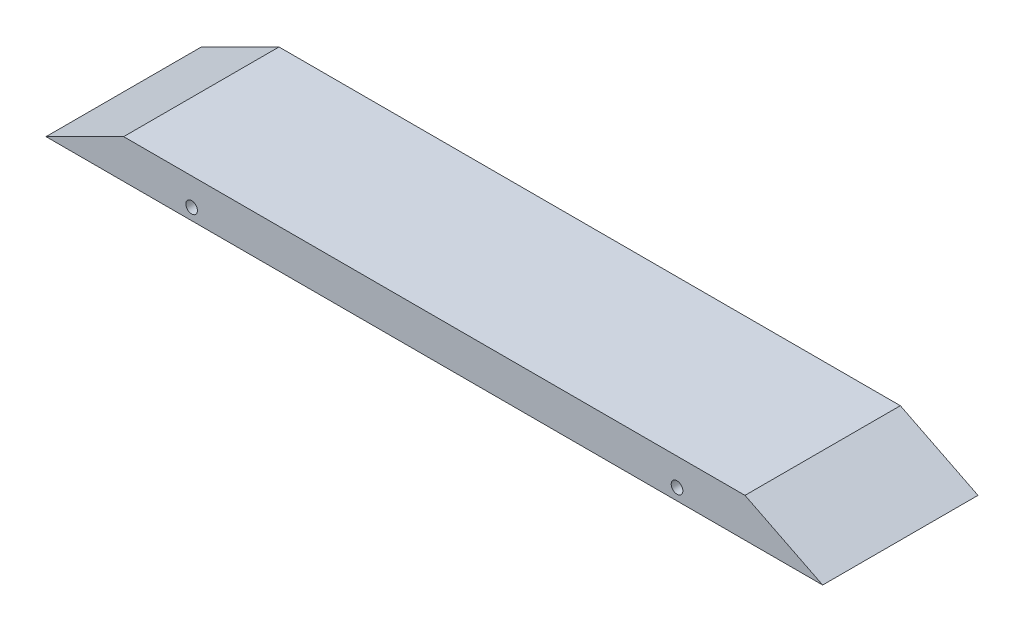
ISO-10303-21;
HEADER;
FILE_DESCRIPTION(('STEP AP214'),'2;1');
FILE_NAME('part.step','',(''),(''),'','','');
FILE_SCHEMA(('AUTOMOTIVE_DESIGN { 1 0 10303 214 1 1 1 1 }'));
ENDSEC;
DATA;
#1=APPLICATION_CONTEXT('core data for automotive mechanical design processes');
#2=APPLICATION_PROTOCOL_DEFINITION('international standard','automotive_design',2000,#1);
#3=PRODUCT_CONTEXT('',#1,'mechanical');
#4=PRODUCT('Part','Part','',(#3));
#5=PRODUCT_RELATED_PRODUCT_CATEGORY('part','',(#4));
#6=PRODUCT_DEFINITION_FORMATION('','',#4);
#7=PRODUCT_DEFINITION_CONTEXT('part definition',#1,'design');
#8=PRODUCT_DEFINITION('design','',#6,#7);
#9=PRODUCT_DEFINITION_SHAPE('','',#8);
#10=(LENGTH_UNIT() NAMED_UNIT(*) SI_UNIT(.MILLI.,.METRE.));
#11=(NAMED_UNIT(*) PLANE_ANGLE_UNIT() SI_UNIT($,.RADIAN.));
#12=(NAMED_UNIT(*) SI_UNIT($,.STERADIAN.) SOLID_ANGLE_UNIT());
#13=UNCERTAINTY_MEASURE_WITH_UNIT(LENGTH_MEASURE(1.E-05),#10,'distance_accuracy_value','');
#14=(GEOMETRIC_REPRESENTATION_CONTEXT(3) GLOBAL_UNCERTAINTY_ASSIGNED_CONTEXT((#13)) GLOBAL_UNIT_ASSIGNED_CONTEXT((#10,
#11,#12)) REPRESENTATION_CONTEXT('',''));
#15=CARTESIAN_POINT('',(0.,0.,0.));
#16=DIRECTION('',(0.,0.,1.));
#17=DIRECTION('',(1.,0.,0.));
#18=AXIS2_PLACEMENT_3D('',#15,#16,#17);
#19=CARTESIAN_POINT('',(20.,9.99999999999998,40.));
#20=DIRECTION('',(0.447213595499957,-0.894427190999916,0.));
#21=DIRECTION('',(0.894427190999916,0.447213595499958,0.));
#22=AXIS2_PLACEMENT_3D('',#19,#20,#21);
#23=PLANE('',#22);
#24=DIRECTION('',(-0.894427190999916,-0.447213595499957,0.));
#25=VECTOR('',#24,1.);
#26=CARTESIAN_POINT('',(20.,9.99999999999998,0.));
#27=LINE('',#26,#25);
#28=CARTESIAN_POINT('',(20.,9.99999999999998,0.));
#29=VERTEX_POINT('',#28);
#30=CARTESIAN_POINT('',(0.,0.,0.));
#31=VERTEX_POINT('',#30);
#32=EDGE_CURVE('E102',#29,#31,#27,.T.);
#33=ORIENTED_EDGE('',*,*,#32,.T.);
#34=DIRECTION('',(0.,0.,-1.));
#35=VECTOR('',#34,1.);
#36=CARTESIAN_POINT('',(0.,0.,40.));
#37=LINE('',#36,#35);
#38=CARTESIAN_POINT('',(0.,0.,40.));
#39=VERTEX_POINT('',#38);
#40=EDGE_CURVE('E11',#39,#31,#37,.T.);
#41=ORIENTED_EDGE('',*,*,#40,.F.);
#42=DIRECTION('',(-0.894427190999916,-0.447213595499957,0.));
#43=VECTOR('',#42,1.);
#44=CARTESIAN_POINT('',(20.,9.99999999999998,40.));
#45=LINE('',#44,#43);
#46=CARTESIAN_POINT('',(20.,9.99999999999998,40.));
#47=VERTEX_POINT('',#46);
#48=EDGE_CURVE('E95',#47,#39,#45,.T.);
#49=ORIENTED_EDGE('',*,*,#48,.F.);
#50=DIRECTION('',(0.,0.,-1.));
#51=VECTOR('',#50,1.);
#52=CARTESIAN_POINT('',(20.,9.99999999999998,40.));
#53=LINE('',#52,#51);
#54=EDGE_CURVE('E99',#47,#29,#53,.T.);
#55=ORIENTED_EDGE('',*,*,#54,.T.);
#56=EDGE_LOOP('',(#33,#41,#49,#55));
#57=FACE_BOUND('',#56,.T.);
#58=ADVANCED_FACE('F41',(#57),#23,.F.);
#59=CARTESIAN_POINT('',(0.,0.,40.));
#60=DIRECTION('',(0.,1.,0.));
#61=DIRECTION('',(0.,0.,1.));
#62=AXIS2_PLACEMENT_3D('',#59,#60,#61);
#63=PLANE('',#62);
#64=DIRECTION('',(1.,0.,0.));
#65=VECTOR('',#64,1.);
#66=CARTESIAN_POINT('',(0.,0.,0.));
#67=LINE('',#66,#65);
#68=CARTESIAN_POINT('',(200.,0.,0.));
#69=VERTEX_POINT('',#68);
#70=EDGE_CURVE('E96',#31,#69,#67,.T.);
#71=ORIENTED_EDGE('',*,*,#70,.T.);
#72=DIRECTION('',(0.,0.,-1.));
#73=VECTOR('',#72,1.);
#74=CARTESIAN_POINT('',(200.,0.,40.));
#75=LINE('',#74,#73);
#76=CARTESIAN_POINT('',(200.,0.,40.));
#77=VERTEX_POINT('',#76);
#78=EDGE_CURVE('E47',#77,#69,#75,.T.);
#79=ORIENTED_EDGE('',*,*,#78,.F.);
#80=DIRECTION('',(1.,0.,0.));
#81=VECTOR('',#80,1.);
#82=CARTESIAN_POINT('',(0.,0.,40.));
#83=LINE('',#82,#81);
#84=EDGE_CURVE('E87',#39,#77,#83,.T.);
#85=ORIENTED_EDGE('',*,*,#84,.F.);
#86=ORIENTED_EDGE('',*,*,#40,.T.);
#87=EDGE_LOOP('',(#71,#79,#85,#86));
#88=FACE_BOUND('',#87,.T.);
#89=ADVANCED_FACE('F92',(#88),#63,.F.);
#90=CARTESIAN_POINT('',(200.,0.,40.));
#91=DIRECTION('',(-0.447213595499958,-0.894427190999916,0.));
#92=DIRECTION('',(0.894427190999916,-0.447213595499958,0.));
#93=AXIS2_PLACEMENT_3D('',#90,#91,#92);
#94=PLANE('',#93);
#95=DIRECTION('',(-0.894427190999916,0.447213595499958,0.));
#96=VECTOR('',#95,1.);
#97=CARTESIAN_POINT('',(200.,0.,0.));
#98=LINE('',#97,#96);
#99=CARTESIAN_POINT('',(180.,10.,0.));
#100=VERTEX_POINT('',#99);
#101=EDGE_CURVE('E74',#69,#100,#98,.T.);
#102=ORIENTED_EDGE('',*,*,#101,.T.);
#103=DIRECTION('',(0.,0.,-1.));
#104=VECTOR('',#103,1.);
#105=CARTESIAN_POINT('',(180.,10.,40.));
#106=LINE('',#105,#104);
#107=CARTESIAN_POINT('',(180.,10.,40.));
#108=VERTEX_POINT('',#107);
#109=EDGE_CURVE('E100',#108,#100,#106,.T.);
#110=ORIENTED_EDGE('',*,*,#109,.F.);
#111=DIRECTION('',(-0.894427190999916,0.447213595499958,0.));
#112=VECTOR('',#111,1.);
#113=CARTESIAN_POINT('',(200.,0.,40.));
#114=LINE('',#113,#112);
#115=EDGE_CURVE('E89',#77,#108,#114,.T.);
#116=ORIENTED_EDGE('',*,*,#115,.F.);
#117=ORIENTED_EDGE('',*,*,#78,.T.);
#118=EDGE_LOOP('',(#102,#110,#116,#117));
#119=FACE_BOUND('',#118,.T.);
#120=ADVANCED_FACE('F98',(#119),#94,.F.);
#121=CARTESIAN_POINT('',(180.,10.,40.));
#122=DIRECTION('',(0.,-1.,0.));
#123=DIRECTION('',(1.,0.,0.));
#124=AXIS2_PLACEMENT_3D('',#121,#122,#123);
#125=PLANE('',#124);
#126=DIRECTION('',(-1.,0.,0.));
#127=VECTOR('',#126,1.);
#128=CARTESIAN_POINT('',(180.,10.,0.));
#129=LINE('',#128,#127);
#130=EDGE_CURVE('E80',#100,#29,#129,.T.);
#131=ORIENTED_EDGE('',*,*,#130,.T.);
#132=ORIENTED_EDGE('',*,*,#54,.F.);
#133=DIRECTION('',(-1.,0.,0.));
#134=VECTOR('',#133,1.);
#135=CARTESIAN_POINT('',(180.,10.,40.));
#136=LINE('',#135,#134);
#137=EDGE_CURVE('E60',#108,#47,#136,.T.);
#138=ORIENTED_EDGE('',*,*,#137,.F.);
#139=ORIENTED_EDGE('',*,*,#109,.T.);
#140=EDGE_LOOP('',(#131,#132,#138,#139));
#141=FACE_BOUND('',#140,.T.);
#142=ADVANCED_FACE('F115',(#141),#125,.F.);
#143=CARTESIAN_POINT('',(0.,0.,40.));
#144=DIRECTION('',(0.,0.,-1.));
#145=DIRECTION('',(-1.,0.,0.));
#146=AXIS2_PLACEMENT_3D('',#143,#144,#145);
#147=PLANE('',#146);
#148=CARTESIAN_POINT('',(37.5,3.,40.));
#149=DIRECTION('',(0.,0.,1.));
#150=DIRECTION('',(1.,0.,0.));
#151=AXIS2_PLACEMENT_3D('',#148,#149,#150);
#152=CIRCLE('',#151,1.5);
#153=CARTESIAN_POINT('',(39.,3.,40.));
#154=VERTEX_POINT('',#153);
#155=EDGE_CURVE('E123',#154,#154,#152,.T.);
#156=ORIENTED_EDGE('',*,*,#155,.F.);
#157=EDGE_LOOP('',(#156));
#158=FACE_BOUND('',#157,.T.);
#159=CARTESIAN_POINT('',(162.5,3.00000000000002,40.));
#160=DIRECTION('',(0.,0.,1.));
#161=DIRECTION('',(1.,0.,0.));
#162=AXIS2_PLACEMENT_3D('',#159,#160,#161);
#163=CIRCLE('',#162,1.5);
#164=CARTESIAN_POINT('',(164.,3.00000000000002,40.));
#165=VERTEX_POINT('',#164);
#166=EDGE_CURVE('E121',#165,#165,#163,.T.);
#167=ORIENTED_EDGE('',*,*,#166,.F.);
#168=EDGE_LOOP('',(#167));
#169=FACE_BOUND('',#168,.T.);
#170=ORIENTED_EDGE('',*,*,#48,.T.);
#171=ORIENTED_EDGE('',*,*,#84,.T.);
#172=ORIENTED_EDGE('',*,*,#115,.T.);
#173=ORIENTED_EDGE('',*,*,#137,.T.);
#174=EDGE_LOOP('',(#170,#171,#172,#173));
#175=FACE_BOUND('',#174,.T.);
#176=ADVANCED_FACE('F86',(#158,#169,#175),#147,.F.);
#177=CARTESIAN_POINT('',(0.,0.,0.));
#178=DIRECTION('',(0.,0.,-1.));
#179=DIRECTION('',(-1.,0.,0.));
#180=AXIS2_PLACEMENT_3D('',#177,#178,#179);
#181=PLANE('',#180);
#182=CARTESIAN_POINT('',(37.5,3.,0.));
#183=DIRECTION('',(0.,0.,1.));
#184=DIRECTION('',(1.,0.,0.));
#185=AXIS2_PLACEMENT_3D('',#182,#183,#184);
#186=CIRCLE('',#185,1.5);
#187=CARTESIAN_POINT('',(39.,3.,0.));
#188=VERTEX_POINT('',#187);
#189=EDGE_CURVE('E110',#188,#188,#186,.T.);
#190=ORIENTED_EDGE('',*,*,#189,.T.);
#191=EDGE_LOOP('',(#190));
#192=FACE_BOUND('',#191,.T.);
#193=CARTESIAN_POINT('',(162.5,3.00000000000002,0.));
#194=DIRECTION('',(0.,0.,1.));
#195=DIRECTION('',(1.,0.,0.));
#196=AXIS2_PLACEMENT_3D('',#193,#194,#195);
#197=CIRCLE('',#196,1.5);
#198=CARTESIAN_POINT('',(164.,3.00000000000002,0.));
#199=VERTEX_POINT('',#198);
#200=EDGE_CURVE('E119',#199,#199,#197,.T.);
#201=ORIENTED_EDGE('',*,*,#200,.T.);
#202=EDGE_LOOP('',(#201));
#203=FACE_BOUND('',#202,.T.);
#204=ORIENTED_EDGE('',*,*,#32,.F.);
#205=ORIENTED_EDGE('',*,*,#130,.F.);
#206=ORIENTED_EDGE('',*,*,#101,.F.);
#207=ORIENTED_EDGE('',*,*,#70,.F.);
#208=EDGE_LOOP('',(#204,#205,#206,#207));
#209=FACE_BOUND('',#208,.T.);
#210=ADVANCED_FACE('F113',(#192,#203,#209),#181,.T.);
#211=CARTESIAN_POINT('',(162.5,3.00000000000002,0.));
#212=DIRECTION('',(0.,0.,1.));
#213=DIRECTION('',(1.,0.,0.));
#214=AXIS2_PLACEMENT_3D('',#211,#212,#213);
#215=CYLINDRICAL_SURFACE('',#214,1.5);
#216=ORIENTED_EDGE('',*,*,#200,.F.);
#217=EDGE_LOOP('',(#216));
#218=FACE_BOUND('',#217,.T.);
#219=ORIENTED_EDGE('',*,*,#166,.T.);
#220=EDGE_LOOP('',(#219));
#221=FACE_BOUND('',#220,.T.);
#222=ADVANCED_FACE('F135',(#218,#221),#215,.F.);
#223=CARTESIAN_POINT('',(37.5,3.,0.));
#224=DIRECTION('',(0.,0.,1.));
#225=DIRECTION('',(1.,0.,0.));
#226=AXIS2_PLACEMENT_3D('',#223,#224,#225);
#227=CYLINDRICAL_SURFACE('',#226,1.5);
#228=ORIENTED_EDGE('',*,*,#189,.F.);
#229=EDGE_LOOP('',(#228));
#230=FACE_BOUND('',#229,.T.);
#231=ORIENTED_EDGE('',*,*,#155,.T.);
#232=EDGE_LOOP('',(#231));
#233=FACE_BOUND('',#232,.T.);
#234=ADVANCED_FACE('F132',(#230,#233),#227,.F.);
#235=CLOSED_SHELL('',(#58,#89,#120,#142,#176,#210,#222,#234));
#236=MANIFOLD_SOLID_BREP('B2',#235);
#237=ADVANCED_BREP_SHAPE_REPRESENTATION('',(#18,#236),#14);
#238=SHAPE_DEFINITION_REPRESENTATION(#9,#237);
ENDSEC;
END-ISO-10303-21;
